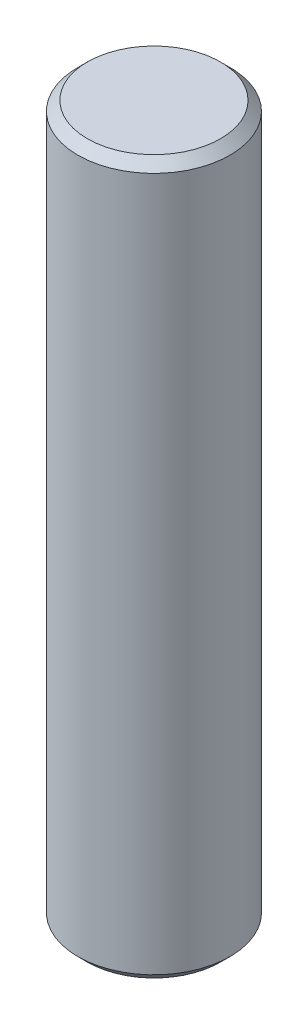
ISO-10303-21;
HEADER;
FILE_DESCRIPTION(('STEP AP214'),'2;1');
FILE_NAME('part.step','',(''),(''),'','','');
FILE_SCHEMA(('AUTOMOTIVE_DESIGN { 1 0 10303 214 1 1 1 1 }'));
ENDSEC;
DATA;
#1=APPLICATION_CONTEXT('core data for automotive mechanical design processes');
#2=APPLICATION_PROTOCOL_DEFINITION('international standard','automotive_design',2000,#1);
#3=PRODUCT_CONTEXT('',#1,'mechanical');
#4=PRODUCT('Part','Part','',(#3));
#5=PRODUCT_RELATED_PRODUCT_CATEGORY('part','',(#4));
#6=PRODUCT_DEFINITION_FORMATION('','',#4);
#7=PRODUCT_DEFINITION_CONTEXT('part definition',#1,'design');
#8=PRODUCT_DEFINITION('design','',#6,#7);
#9=PRODUCT_DEFINITION_SHAPE('','',#8);
#10=(LENGTH_UNIT() NAMED_UNIT(*) SI_UNIT(.MILLI.,.METRE.));
#11=(NAMED_UNIT(*) PLANE_ANGLE_UNIT() SI_UNIT($,.RADIAN.));
#12=(NAMED_UNIT(*) SI_UNIT($,.STERADIAN.) SOLID_ANGLE_UNIT());
#13=UNCERTAINTY_MEASURE_WITH_UNIT(LENGTH_MEASURE(1.E-05),#10,'distance_accuracy_value','');
#14=(GEOMETRIC_REPRESENTATION_CONTEXT(3) GLOBAL_UNCERTAINTY_ASSIGNED_CONTEXT((#13)) GLOBAL_UNIT_ASSIGNED_CONTEXT((#10,
#11,#12)) REPRESENTATION_CONTEXT('',''));
#15=CARTESIAN_POINT('',(0.,0.,0.));
#16=DIRECTION('',(0.,0.,1.));
#17=DIRECTION('',(1.,0.,0.));
#18=AXIS2_PLACEMENT_3D('',#15,#16,#17);
#19=CARTESIAN_POINT('',(0.,150.,0.));
#20=DIRECTION('',(0.,-1.,0.));
#21=DIRECTION('',(0.,0.,-1.));
#22=AXIS2_PLACEMENT_3D('',#19,#20,#21);
#23=CYLINDRICAL_SURFACE('',#22,16.);
#24=CARTESIAN_POINT('',(0.,1.99999999999997,0.));
#25=DIRECTION('',(0.,1.,0.));
#26=DIRECTION('',(0.,0.,1.));
#27=AXIS2_PLACEMENT_3D('',#24,#25,#26);
#28=CIRCLE('',#27,16.);
#29=CARTESIAN_POINT('',(0.,1.99999999999997,16.));
#30=VERTEX_POINT('',#29);
#31=EDGE_CURVE('E70',#30,#30,#28,.T.);
#32=ORIENTED_EDGE('',*,*,#31,.T.);
#33=EDGE_LOOP('',(#32));
#34=FACE_BOUND('',#33,.T.);
#35=CARTESIAN_POINT('',(0.,148.,0.));
#36=DIRECTION('',(0.,1.,0.));
#37=DIRECTION('',(0.,0.,1.));
#38=AXIS2_PLACEMENT_3D('',#35,#36,#37);
#39=CIRCLE('',#38,16.);
#40=CARTESIAN_POINT('',(0.,148.,16.));
#41=VERTEX_POINT('',#40);
#42=EDGE_CURVE('E76',#41,#41,#39,.F.);
#43=ORIENTED_EDGE('',*,*,#42,.T.);
#44=EDGE_LOOP('',(#43));
#45=FACE_BOUND('',#44,.T.);
#46=ADVANCED_FACE('F55',(#34,#45),#23,.T.);
#47=CARTESIAN_POINT('',(0.,150.,0.));
#48=DIRECTION('',(0.,1.,0.));
#49=DIRECTION('',(0.,0.,1.));
#50=AXIS2_PLACEMENT_3D('',#47,#48,#49);
#51=PLANE('',#50);
#52=CARTESIAN_POINT('',(0.,150.,0.));
#53=DIRECTION('',(0.,1.,0.));
#54=DIRECTION('',(0.,0.,1.));
#55=AXIS2_PLACEMENT_3D('',#52,#53,#54);
#56=CIRCLE('',#55,14.);
#57=CARTESIAN_POINT('',(0.,150.,14.));
#58=VERTEX_POINT('',#57);
#59=EDGE_CURVE('E12',#58,#58,#56,.T.);
#60=ORIENTED_EDGE('',*,*,#59,.T.);
#61=EDGE_LOOP('',(#60));
#62=FACE_BOUND('',#61,.T.);
#63=ADVANCED_FACE('F94',(#62),#51,.T.);
#64=CARTESIAN_POINT('',(0.,0.,0.));
#65=DIRECTION('',(0.,1.,0.));
#66=DIRECTION('',(0.,0.,1.));
#67=AXIS2_PLACEMENT_3D('',#64,#65,#66);
#68=PLANE('',#67);
#69=CARTESIAN_POINT('',(0.,0.,0.));
#70=DIRECTION('',(0.,1.,0.));
#71=DIRECTION('',(0.,0.,1.));
#72=AXIS2_PLACEMENT_3D('',#69,#70,#71);
#73=CIRCLE('',#72,14.);
#74=CARTESIAN_POINT('',(0.,0.,14.));
#75=VERTEX_POINT('',#74);
#76=EDGE_CURVE('E64',#75,#75,#73,.F.);
#77=ORIENTED_EDGE('',*,*,#76,.T.);
#78=EDGE_LOOP('',(#77));
#79=FACE_BOUND('',#78,.T.);
#80=ADVANCED_FACE('F91',(#79),#68,.F.);
#81=CARTESIAN_POINT('',(0.,1.99999999999997,0.));
#82=DIRECTION('',(0.,1.,0.));
#83=DIRECTION('',(0.,0.,1.));
#84=AXIS2_PLACEMENT_3D('',#81,#82,#83);
#85=CONICAL_SURFACE('',#84,16.,0.785398163397452);
#86=ORIENTED_EDGE('',*,*,#76,.F.);
#87=EDGE_LOOP('',(#86));
#88=FACE_BOUND('',#87,.T.);
#89=ORIENTED_EDGE('',*,*,#31,.F.);
#90=EDGE_LOOP('',(#89));
#91=FACE_BOUND('',#90,.T.);
#92=ADVANCED_FACE('F87',(#88,#91),#85,.T.);
#93=CARTESIAN_POINT('',(0.,150.,0.));
#94=DIRECTION('',(0.,-1.,0.));
#95=DIRECTION('',(0.,0.,-1.));
#96=AXIS2_PLACEMENT_3D('',#93,#94,#95);
#97=CONICAL_SURFACE('',#96,14.,0.785398163397448);
#98=ORIENTED_EDGE('',*,*,#42,.F.);
#99=EDGE_LOOP('',(#98));
#100=FACE_BOUND('',#99,.T.);
#101=ORIENTED_EDGE('',*,*,#59,.F.);
#102=EDGE_LOOP('',(#101));
#103=FACE_BOUND('',#102,.T.);
#104=ADVANCED_FACE('F58',(#100,#103),#97,.T.);
#105=CLOSED_SHELL('',(#46,#63,#80,#92,#104));
#106=MANIFOLD_SOLID_BREP('B2',#105);
#107=ADVANCED_BREP_SHAPE_REPRESENTATION('',(#18,#106),#14);
#108=SHAPE_DEFINITION_REPRESENTATION(#9,#107);
ENDSEC;
END-ISO-10303-21;
